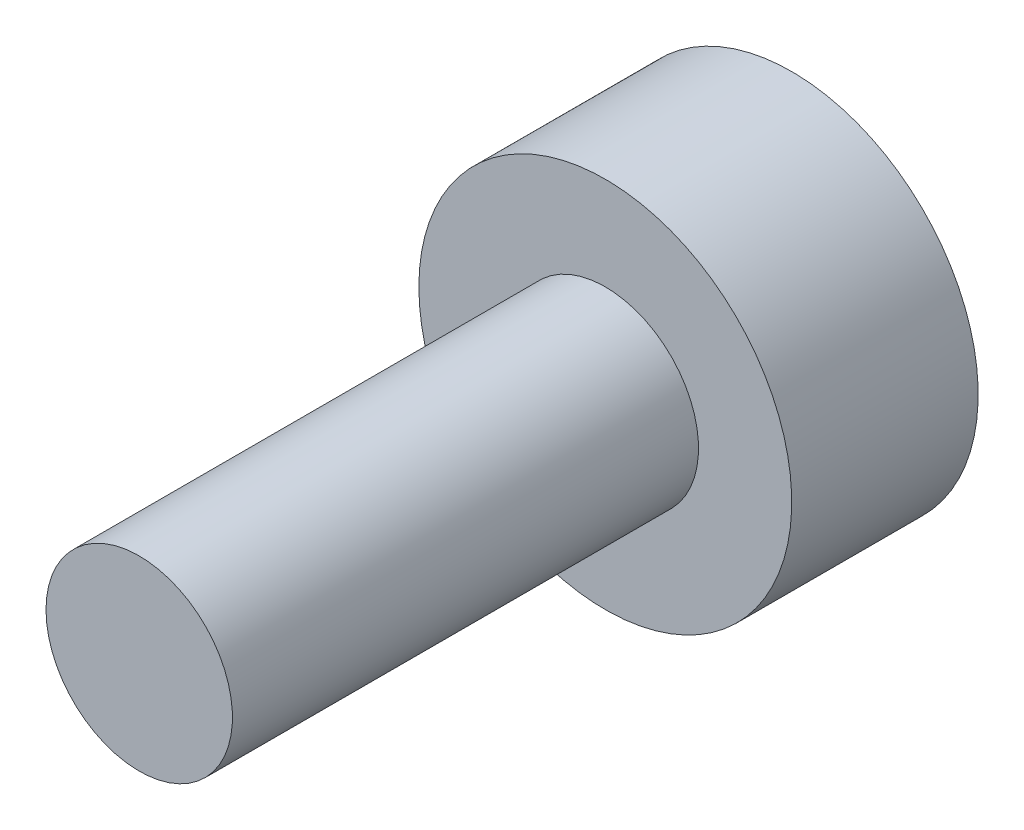
ISO-10303-21;
HEADER;
FILE_DESCRIPTION(('STEP AP214'),'2;1');
FILE_NAME('part.step','',(''),(''),'','','');
FILE_SCHEMA(('AUTOMOTIVE_DESIGN { 1 0 10303 214 1 1 1 1 }'));
ENDSEC;
DATA;
#1=APPLICATION_CONTEXT('core data for automotive mechanical design processes');
#2=APPLICATION_PROTOCOL_DEFINITION('international standard','automotive_design',2000,#1);
#3=PRODUCT_CONTEXT('',#1,'mechanical');
#4=PRODUCT('Part','Part','',(#3));
#5=PRODUCT_RELATED_PRODUCT_CATEGORY('part','',(#4));
#6=PRODUCT_DEFINITION_FORMATION('','',#4);
#7=PRODUCT_DEFINITION_CONTEXT('part definition',#1,'design');
#8=PRODUCT_DEFINITION('design','',#6,#7);
#9=PRODUCT_DEFINITION_SHAPE('','',#8);
#10=(LENGTH_UNIT() NAMED_UNIT(*) SI_UNIT(.MILLI.,.METRE.));
#11=(NAMED_UNIT(*) PLANE_ANGLE_UNIT() SI_UNIT($,.RADIAN.));
#12=(NAMED_UNIT(*) SI_UNIT($,.STERADIAN.) SOLID_ANGLE_UNIT());
#13=UNCERTAINTY_MEASURE_WITH_UNIT(LENGTH_MEASURE(1.E-05),#10,'distance_accuracy_value','');
#14=(GEOMETRIC_REPRESENTATION_CONTEXT(3) GLOBAL_UNCERTAINTY_ASSIGNED_CONTEXT((#13)) GLOBAL_UNIT_ASSIGNED_CONTEXT((#10,
#11,#12)) REPRESENTATION_CONTEXT('',''));
#15=CARTESIAN_POINT('',(0.,0.,0.));
#16=DIRECTION('',(0.,0.,1.));
#17=DIRECTION('',(1.,0.,0.));
#18=AXIS2_PLACEMENT_3D('',#15,#16,#17);
#19=CARTESIAN_POINT('',(0.,0.,0.));
#20=DIRECTION('',(0.,0.,-1.));
#21=DIRECTION('',(-1.,0.,0.));
#22=AXIS2_PLACEMENT_3D('',#19,#20,#21);
#23=PLANE('',#22);
#24=CARTESIAN_POINT('',(0.,0.,0.));
#25=DIRECTION('',(0.,0.,-1.));
#26=DIRECTION('',(-1.,0.,0.));
#27=AXIS2_PLACEMENT_3D('',#24,#25,#26);
#28=CIRCLE('',#27,1.);
#29=CARTESIAN_POINT('',(-1.,0.,0.));
#30=VERTEX_POINT('',#29);
#31=EDGE_CURVE('E11',#30,#30,#28,.T.);
#32=ORIENTED_EDGE('',*,*,#31,.F.);
#33=EDGE_LOOP('',(#32));
#34=FACE_BOUND('',#33,.T.);
#35=ADVANCED_FACE('F39',(#34),#23,.F.);
#36=CARTESIAN_POINT('',(0.,0.,-7.));
#37=DIRECTION('',(0.,0.,-1.));
#38=DIRECTION('',(-1.,0.,0.));
#39=AXIS2_PLACEMENT_3D('',#36,#37,#38);
#40=CYLINDRICAL_SURFACE('',#39,1.);
#41=CARTESIAN_POINT('',(0.,0.,-5.));
#42=DIRECTION('',(0.,0.,-1.));
#43=DIRECTION('',(-1.,0.,0.));
#44=AXIS2_PLACEMENT_3D('',#41,#42,#43);
#45=CIRCLE('',#44,0.999999999999999);
#46=CARTESIAN_POINT('',(-0.999999999999999,0.,-5.));
#47=VERTEX_POINT('',#46);
#48=EDGE_CURVE('E46',#47,#47,#45,.T.);
#49=ORIENTED_EDGE('',*,*,#48,.F.);
#50=EDGE_LOOP('',(#49));
#51=FACE_BOUND('',#50,.T.);
#52=ORIENTED_EDGE('',*,*,#31,.T.);
#53=EDGE_LOOP('',(#52));
#54=FACE_BOUND('',#53,.T.);
#55=ADVANCED_FACE('F155',(#51,#54),#40,.T.);
#56=CARTESIAN_POINT('',(1.,0.,-5.));
#57=DIRECTION('',(0.,0.,-1.));
#58=DIRECTION('',(-1.,0.,0.));
#59=AXIS2_PLACEMENT_3D('',#56,#57,#58);
#60=PLANE('',#59);
#61=CARTESIAN_POINT('',(0.,0.,-5.));
#62=DIRECTION('',(0.,0.,-1.));
#63=DIRECTION('',(-1.,0.,0.));
#64=AXIS2_PLACEMENT_3D('',#61,#62,#63);
#65=CIRCLE('',#64,2.);
#66=CARTESIAN_POINT('',(-2.,0.,-5.));
#67=VERTEX_POINT('',#66);
#68=EDGE_CURVE('E148',#67,#67,#65,.T.);
#69=ORIENTED_EDGE('',*,*,#68,.F.);
#70=EDGE_LOOP('',(#69));
#71=FACE_BOUND('',#70,.T.);
#72=ORIENTED_EDGE('',*,*,#48,.T.);
#73=EDGE_LOOP('',(#72));
#74=FACE_BOUND('',#73,.T.);
#75=ADVANCED_FACE('F153',(#71,#74),#60,.F.);
#76=CARTESIAN_POINT('',(0.,0.,-7.));
#77=DIRECTION('',(0.,0.,-1.));
#78=DIRECTION('',(-1.,0.,0.));
#79=AXIS2_PLACEMENT_3D('',#76,#77,#78);
#80=CYLINDRICAL_SURFACE('',#79,2.);
#81=CARTESIAN_POINT('',(0.,0.,-7.));
#82=DIRECTION('',(0.,0.,-1.));
#83=DIRECTION('',(-1.,0.,0.));
#84=AXIS2_PLACEMENT_3D('',#81,#82,#83);
#85=CIRCLE('',#84,2.);
#86=CARTESIAN_POINT('',(-2.,0.,-7.));
#87=VERTEX_POINT('',#86);
#88=EDGE_CURVE('E140',#87,#87,#85,.T.);
#89=ORIENTED_EDGE('',*,*,#88,.F.);
#90=EDGE_LOOP('',(#89));
#91=FACE_BOUND('',#90,.T.);
#92=ORIENTED_EDGE('',*,*,#68,.T.);
#93=EDGE_LOOP('',(#92));
#94=FACE_BOUND('',#93,.T.);
#95=ADVANCED_FACE('F173',(#91,#94),#80,.T.);
#96=CARTESIAN_POINT('',(2.,0.,-7.));
#97=DIRECTION('',(0.,0.,1.));
#98=DIRECTION('',(1.,0.,0.));
#99=AXIS2_PLACEMENT_3D('',#96,#97,#98);
#100=PLANE('',#99);
#101=DIRECTION('',(1.,0.,0.));
#102=VECTOR('',#101,1.);
#103=CARTESIAN_POINT('',(-0.433012701892218,0.75,-7.));
#104=LINE('',#103,#102);
#105=CARTESIAN_POINT('',(-0.433012701892218,0.75,-7.));
#106=VERTEX_POINT('',#105);
#107=CARTESIAN_POINT('',(0.43301270189222,0.75,-7.));
#108=VERTEX_POINT('',#107);
#109=EDGE_CURVE('E127',#106,#108,#104,.T.);
#110=ORIENTED_EDGE('',*,*,#109,.F.);
#111=DIRECTION('',(0.5,0.866025403784438,0.));
#112=VECTOR('',#111,1.);
#113=CARTESIAN_POINT('',(-0.866025403784438,0.,-7.));
#114=LINE('',#113,#112);
#115=CARTESIAN_POINT('',(-0.866025403784438,0.,-7.));
#116=VERTEX_POINT('',#115);
#117=EDGE_CURVE('E53',#116,#106,#114,.T.);
#118=ORIENTED_EDGE('',*,*,#117,.F.);
#119=DIRECTION('',(-0.5,0.866025403784439,0.));
#120=VECTOR('',#119,1.);
#121=CARTESIAN_POINT('',(-0.433012701892218,-0.75,-7.));
#122=LINE('',#121,#120);
#123=CARTESIAN_POINT('',(-0.433012701892218,-0.75,-7.));
#124=VERTEX_POINT('',#123);
#125=EDGE_CURVE('E136',#124,#116,#122,.T.);
#126=ORIENTED_EDGE('',*,*,#125,.F.);
#127=DIRECTION('',(-1.,0.,0.));
#128=VECTOR('',#127,1.);
#129=CARTESIAN_POINT('',(0.43301270189222,-0.75,-7.));
#130=LINE('',#129,#128);
#131=CARTESIAN_POINT('',(0.43301270189222,-0.75,-7.));
#132=VERTEX_POINT('',#131);
#133=EDGE_CURVE('E134',#132,#124,#130,.T.);
#134=ORIENTED_EDGE('',*,*,#133,.F.);
#135=DIRECTION('',(-0.5,-0.866025403784439,0.));
#136=VECTOR('',#135,1.);
#137=CARTESIAN_POINT('',(0.86602540378444,0.,-7.));
#138=LINE('',#137,#136);
#139=CARTESIAN_POINT('',(0.86602540378444,0.,-7.));
#140=VERTEX_POINT('',#139);
#141=EDGE_CURVE('E101',#140,#132,#138,.T.);
#142=ORIENTED_EDGE('',*,*,#141,.F.);
#143=DIRECTION('',(0.5,-0.866025403784439,0.));
#144=VECTOR('',#143,1.);
#145=CARTESIAN_POINT('',(0.43301270189222,0.75,-7.));
#146=LINE('',#145,#144);
#147=EDGE_CURVE('E130',#108,#140,#146,.T.);
#148=ORIENTED_EDGE('',*,*,#147,.F.);
#149=EDGE_LOOP('',(#110,#118,#126,#134,#142,#148));
#150=FACE_BOUND('',#149,.T.);
#151=ORIENTED_EDGE('',*,*,#88,.T.);
#152=EDGE_LOOP('',(#151));
#153=FACE_BOUND('',#152,.T.);
#154=ADVANCED_FACE('F181',(#150,#153),#100,.F.);
#155=CARTESIAN_POINT('',(-0.866025403784438,0.,-5.8));
#156=DIRECTION('',(-0.866025403784438,0.5,0.));
#157=DIRECTION('',(-0.5,-0.866025403784439,0.));
#158=AXIS2_PLACEMENT_3D('',#155,#156,#157);
#159=PLANE('',#158);
#160=ORIENTED_EDGE('',*,*,#117,.T.);
#161=DIRECTION('',(0.,0.,-1.));
#162=VECTOR('',#161,1.);
#163=CARTESIAN_POINT('',(-0.433012701892219,0.75,-5.8));
#164=LINE('',#163,#162);
#165=CARTESIAN_POINT('',(-0.433012701892219,0.75,-5.8));
#166=VERTEX_POINT('',#165);
#167=EDGE_CURVE('E83',#166,#106,#164,.T.);
#168=ORIENTED_EDGE('',*,*,#167,.F.);
#169=DIRECTION('',(0.5,0.866025403784438,0.));
#170=VECTOR('',#169,1.);
#171=CARTESIAN_POINT('',(-0.866025403784438,0.,-5.8));
#172=LINE('',#171,#170);
#173=CARTESIAN_POINT('',(-0.866025403784438,0.,-5.8));
#174=VERTEX_POINT('',#173);
#175=EDGE_CURVE('E138',#174,#166,#172,.T.);
#176=ORIENTED_EDGE('',*,*,#175,.F.);
#177=DIRECTION('',(0.,0.,-1.));
#178=VECTOR('',#177,1.);
#179=CARTESIAN_POINT('',(-0.866025403784438,0.,-5.8));
#180=LINE('',#179,#178);
#181=EDGE_CURVE('E61',#174,#116,#180,.T.);
#182=ORIENTED_EDGE('',*,*,#181,.T.);
#183=EDGE_LOOP('',(#160,#168,#176,#182));
#184=FACE_BOUND('',#183,.T.);
#185=ADVANCED_FACE('F189',(#184),#159,.F.);
#186=CARTESIAN_POINT('',(-0.433012701892219,-0.75,-5.8));
#187=DIRECTION('',(-0.866025403784439,-0.5,0.));
#188=DIRECTION('',(0.5,-0.866025403784439,0.));
#189=AXIS2_PLACEMENT_3D('',#186,#187,#188);
#190=PLANE('',#189);
#191=ORIENTED_EDGE('',*,*,#125,.T.);
#192=ORIENTED_EDGE('',*,*,#181,.F.);
#193=DIRECTION('',(-0.5,0.866025403784439,0.));
#194=VECTOR('',#193,1.);
#195=CARTESIAN_POINT('',(-0.433012701892219,-0.75,-5.8));
#196=LINE('',#195,#194);
#197=CARTESIAN_POINT('',(-0.433012701892219,-0.75,-5.8));
#198=VERTEX_POINT('',#197);
#199=EDGE_CURVE('E113',#198,#174,#196,.T.);
#200=ORIENTED_EDGE('',*,*,#199,.F.);
#201=DIRECTION('',(0.,0.,-1.));
#202=VECTOR('',#201,1.);
#203=CARTESIAN_POINT('',(-0.433012701892219,-0.75,-5.8));
#204=LINE('',#203,#202);
#205=EDGE_CURVE('E105',#198,#124,#204,.T.);
#206=ORIENTED_EDGE('',*,*,#205,.T.);
#207=EDGE_LOOP('',(#191,#192,#200,#206));
#208=FACE_BOUND('',#207,.T.);
#209=ADVANCED_FACE('F197',(#208),#190,.F.);
#210=CARTESIAN_POINT('',(0.43301270189222,-0.75,-5.8));
#211=DIRECTION('',(0.,-1.,0.));
#212=DIRECTION('',(0.,0.,-1.));
#213=AXIS2_PLACEMENT_3D('',#210,#211,#212);
#214=PLANE('',#213);
#215=ORIENTED_EDGE('',*,*,#133,.T.);
#216=ORIENTED_EDGE('',*,*,#205,.F.);
#217=DIRECTION('',(-1.,0.,0.));
#218=VECTOR('',#217,1.);
#219=CARTESIAN_POINT('',(0.43301270189222,-0.75,-5.8));
#220=LINE('',#219,#218);
#221=CARTESIAN_POINT('',(0.43301270189222,-0.75,-5.8));
#222=VERTEX_POINT('',#221);
#223=EDGE_CURVE('E109',#222,#198,#220,.T.);
#224=ORIENTED_EDGE('',*,*,#223,.F.);
#225=DIRECTION('',(0.,0.,-1.));
#226=VECTOR('',#225,1.);
#227=CARTESIAN_POINT('',(0.43301270189222,-0.75,-5.8));
#228=LINE('',#227,#226);
#229=EDGE_CURVE('E94',#222,#132,#228,.T.);
#230=ORIENTED_EDGE('',*,*,#229,.T.);
#231=EDGE_LOOP('',(#215,#216,#224,#230));
#232=FACE_BOUND('',#231,.T.);
#233=ADVANCED_FACE('F110',(#232),#214,.F.);
#234=CARTESIAN_POINT('',(0.866025403784439,0.,-5.8));
#235=DIRECTION('',(0.866025403784439,-0.5,0.));
#236=DIRECTION('',(0.5,0.866025403784439,0.));
#237=AXIS2_PLACEMENT_3D('',#234,#235,#236);
#238=PLANE('',#237);
#239=ORIENTED_EDGE('',*,*,#141,.T.);
#240=ORIENTED_EDGE('',*,*,#229,.F.);
#241=DIRECTION('',(-0.5,-0.866025403784439,0.));
#242=VECTOR('',#241,1.);
#243=CARTESIAN_POINT('',(0.866025403784439,0.,-5.8));
#244=LINE('',#243,#242);
#245=CARTESIAN_POINT('',(0.866025403784439,0.,-5.8));
#246=VERTEX_POINT('',#245);
#247=EDGE_CURVE('E98',#246,#222,#244,.T.);
#248=ORIENTED_EDGE('',*,*,#247,.F.);
#249=DIRECTION('',(0.,0.,-1.));
#250=VECTOR('',#249,1.);
#251=CARTESIAN_POINT('',(0.866025403784439,0.,-5.8));
#252=LINE('',#251,#250);
#253=EDGE_CURVE('E106',#246,#140,#252,.T.);
#254=ORIENTED_EDGE('',*,*,#253,.T.);
#255=EDGE_LOOP('',(#239,#240,#248,#254));
#256=FACE_BOUND('',#255,.T.);
#257=ADVANCED_FACE('F96',(#256),#238,.F.);
#258=CARTESIAN_POINT('',(0.43301270189222,0.75,-5.8));
#259=DIRECTION('',(0.866025403784439,0.5,0.));
#260=DIRECTION('',(-0.5,0.866025403784439,0.));
#261=AXIS2_PLACEMENT_3D('',#258,#259,#260);
#262=PLANE('',#261);
#263=ORIENTED_EDGE('',*,*,#147,.T.);
#264=ORIENTED_EDGE('',*,*,#253,.F.);
#265=DIRECTION('',(0.5,-0.866025403784439,0.));
#266=VECTOR('',#265,1.);
#267=CARTESIAN_POINT('',(0.43301270189222,0.75,-5.8));
#268=LINE('',#267,#266);
#269=CARTESIAN_POINT('',(0.43301270189222,0.75,-5.8));
#270=VERTEX_POINT('',#269);
#271=EDGE_CURVE('E119',#270,#246,#268,.T.);
#272=ORIENTED_EDGE('',*,*,#271,.F.);
#273=DIRECTION('',(0.,0.,-1.));
#274=VECTOR('',#273,1.);
#275=CARTESIAN_POINT('',(0.43301270189222,0.75,-5.8));
#276=LINE('',#275,#274);
#277=EDGE_CURVE('E143',#270,#108,#276,.T.);
#278=ORIENTED_EDGE('',*,*,#277,.T.);
#279=EDGE_LOOP('',(#263,#264,#272,#278));
#280=FACE_BOUND('',#279,.T.);
#281=ADVANCED_FACE('F216',(#280),#262,.F.);
#282=CARTESIAN_POINT('',(-0.433012701892219,0.75,-5.8));
#283=DIRECTION('',(0.,1.,0.));
#284=DIRECTION('',(-1.,0.,0.));
#285=AXIS2_PLACEMENT_3D('',#282,#283,#284);
#286=PLANE('',#285);
#287=ORIENTED_EDGE('',*,*,#109,.T.);
#288=ORIENTED_EDGE('',*,*,#277,.F.);
#289=DIRECTION('',(1.,0.,0.));
#290=VECTOR('',#289,1.);
#291=CARTESIAN_POINT('',(-0.433012701892219,0.75,-5.8));
#292=LINE('',#291,#290);
#293=EDGE_CURVE('E121',#166,#270,#292,.T.);
#294=ORIENTED_EDGE('',*,*,#293,.F.);
#295=ORIENTED_EDGE('',*,*,#167,.T.);
#296=EDGE_LOOP('',(#287,#288,#294,#295));
#297=FACE_BOUND('',#296,.T.);
#298=ADVANCED_FACE('F223',(#297),#286,.F.);
#299=CARTESIAN_POINT('',(0.,0.,-5.8));
#300=DIRECTION('',(0.,0.,-1.));
#301=DIRECTION('',(-1.,0.,0.));
#302=AXIS2_PLACEMENT_3D('',#299,#300,#301);
#303=PLANE('',#302);
#304=ORIENTED_EDGE('',*,*,#175,.T.);
#305=ORIENTED_EDGE('',*,*,#293,.T.);
#306=ORIENTED_EDGE('',*,*,#271,.T.);
#307=ORIENTED_EDGE('',*,*,#247,.T.);
#308=ORIENTED_EDGE('',*,*,#223,.T.);
#309=ORIENTED_EDGE('',*,*,#199,.T.);
#310=EDGE_LOOP('',(#304,#305,#306,#307,#308,#309));
#311=FACE_BOUND('',#310,.T.);
#312=ADVANCED_FACE('F116',(#311),#303,.T.);
#313=CLOSED_SHELL('',(#35,#55,#75,#95,#154,#185,#209,#233,#257,#281,#298,#312));
#314=MANIFOLD_SOLID_BREP('B2',#313);
#315=ADVANCED_BREP_SHAPE_REPRESENTATION('',(#18,#314),#14);
#316=SHAPE_DEFINITION_REPRESENTATION(#9,#315);
ENDSEC;
END-ISO-10303-21;
